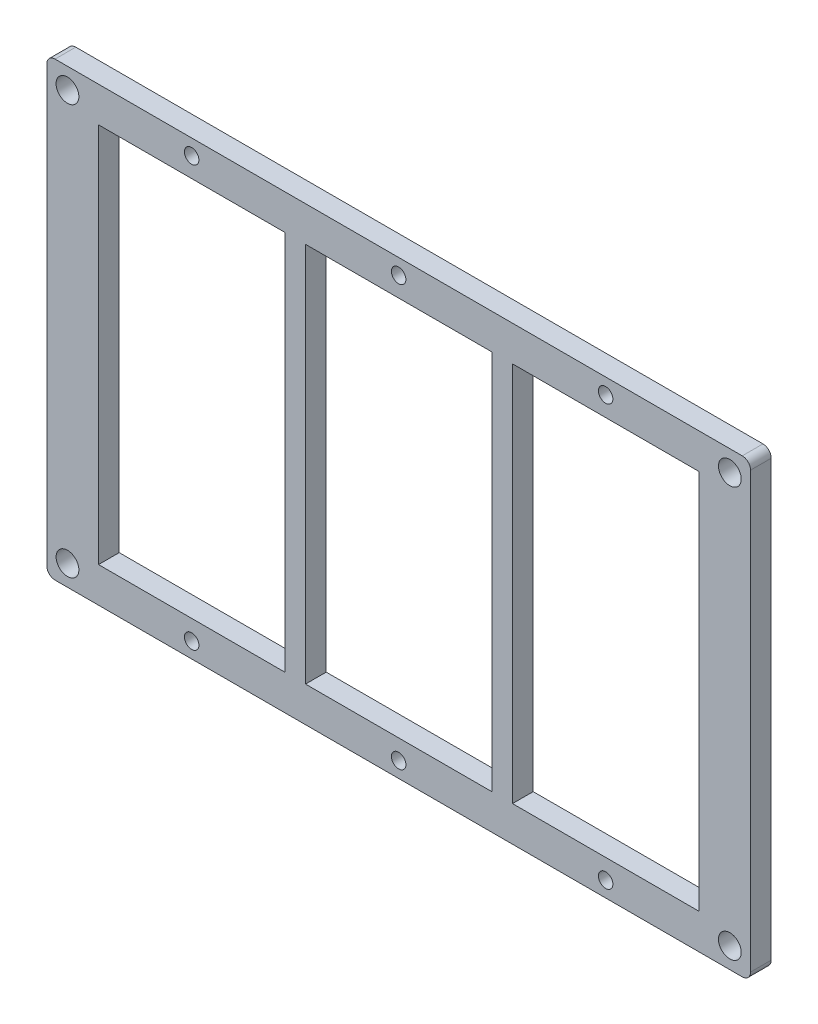
ISO-10303-21;
HEADER;
FILE_DESCRIPTION(('STEP AP214'),'2;1');
FILE_NAME('part.step','',(''),(''),'','','');
FILE_SCHEMA(('AUTOMOTIVE_DESIGN { 1 0 10303 214 1 1 1 1 }'));
ENDSEC;
DATA;
#1=APPLICATION_CONTEXT('core data for automotive mechanical design processes');
#2=APPLICATION_PROTOCOL_DEFINITION('international standard','automotive_design',2000,#1);
#3=PRODUCT_CONTEXT('',#1,'mechanical');
#4=PRODUCT('Part','Part','',(#3));
#5=PRODUCT_RELATED_PRODUCT_CATEGORY('part','',(#4));
#6=PRODUCT_DEFINITION_FORMATION('','',#4);
#7=PRODUCT_DEFINITION_CONTEXT('part definition',#1,'design');
#8=PRODUCT_DEFINITION('design','',#6,#7);
#9=PRODUCT_DEFINITION_SHAPE('','',#8);
#10=(LENGTH_UNIT() NAMED_UNIT(*) SI_UNIT(.MILLI.,.METRE.));
#11=(NAMED_UNIT(*) PLANE_ANGLE_UNIT() SI_UNIT($,.RADIAN.));
#12=(NAMED_UNIT(*) SI_UNIT($,.STERADIAN.) SOLID_ANGLE_UNIT());
#13=UNCERTAINTY_MEASURE_WITH_UNIT(LENGTH_MEASURE(1.E-05),#10,'distance_accuracy_value','');
#14=(GEOMETRIC_REPRESENTATION_CONTEXT(3) GLOBAL_UNCERTAINTY_ASSIGNED_CONTEXT((#13)) GLOBAL_UNIT_ASSIGNED_CONTEXT((#10,
#11,#12)) REPRESENTATION_CONTEXT('',''));
#15=CARTESIAN_POINT('',(0.,0.,0.));
#16=DIRECTION('',(0.,0.,1.));
#17=DIRECTION('',(1.,0.,0.));
#18=AXIS2_PLACEMENT_3D('',#15,#16,#17);
#19=CARTESIAN_POINT('',(100.,-50.75,0.));
#20=DIRECTION('',(0.,0.,1.));
#21=DIRECTION('',(1.,0.,0.));
#22=AXIS2_PLACEMENT_3D('',#19,#20,#21);
#23=CYLINDRICAL_SURFACE('',#22,1.75);
#24=CARTESIAN_POINT('',(100.,-50.75,0.));
#25=DIRECTION('',(0.,0.,1.));
#26=DIRECTION('',(1.,0.,0.));
#27=AXIS2_PLACEMENT_3D('',#24,#25,#26);
#28=CIRCLE('',#27,1.75);
#29=CARTESIAN_POINT('',(101.75,-50.75,0.));
#30=VERTEX_POINT('',#29);
#31=EDGE_CURVE('E272',#30,#30,#28,.T.);
#32=ORIENTED_EDGE('',*,*,#31,.F.);
#33=EDGE_LOOP('',(#32));
#34=FACE_BOUND('',#33,.T.);
#35=CARTESIAN_POINT('',(100.,-50.75,5.));
#36=DIRECTION('',(0.,0.,1.));
#37=DIRECTION('',(1.,0.,0.));
#38=AXIS2_PLACEMENT_3D('',#35,#36,#37);
#39=CIRCLE('',#38,1.75);
#40=CARTESIAN_POINT('',(101.75,-50.75,5.));
#41=VERTEX_POINT('',#40);
#42=EDGE_CURVE('E275',#41,#41,#39,.T.);
#43=ORIENTED_EDGE('',*,*,#42,.T.);
#44=EDGE_LOOP('',(#43));
#45=FACE_BOUND('',#44,.T.);
#46=ADVANCED_FACE('F33',(#34,#45),#23,.F.);
#47=CARTESIAN_POINT('',(100.,50.75,0.));
#48=DIRECTION('',(0.,0.,1.));
#49=DIRECTION('',(1.,0.,0.));
#50=AXIS2_PLACEMENT_3D('',#47,#48,#49);
#51=CYLINDRICAL_SURFACE('',#50,1.75);
#52=CARTESIAN_POINT('',(100.,50.75,0.));
#53=DIRECTION('',(0.,0.,1.));
#54=DIRECTION('',(1.,0.,0.));
#55=AXIS2_PLACEMENT_3D('',#52,#53,#54);
#56=CIRCLE('',#55,1.75);
#57=CARTESIAN_POINT('',(101.75,50.75,0.));
#58=VERTEX_POINT('',#57);
#59=EDGE_CURVE('E259',#58,#58,#56,.T.);
#60=ORIENTED_EDGE('',*,*,#59,.F.);
#61=EDGE_LOOP('',(#60));
#62=FACE_BOUND('',#61,.T.);
#63=CARTESIAN_POINT('',(100.,50.75,5.));
#64=DIRECTION('',(0.,0.,1.));
#65=DIRECTION('',(1.,0.,0.));
#66=AXIS2_PLACEMENT_3D('',#63,#64,#65);
#67=CIRCLE('',#66,1.75);
#68=CARTESIAN_POINT('',(101.75,50.75,5.));
#69=VERTEX_POINT('',#68);
#70=EDGE_CURVE('E269',#69,#69,#67,.T.);
#71=ORIENTED_EDGE('',*,*,#70,.T.);
#72=EDGE_LOOP('',(#71));
#73=FACE_BOUND('',#72,.T.);
#74=ADVANCED_FACE('F410',(#62,#73),#51,.F.);
#75=CARTESIAN_POINT('',(0.,0.,5.));
#76=DIRECTION('',(0.,0.,1.));
#77=DIRECTION('',(1.,0.,0.));
#78=AXIS2_PLACEMENT_3D('',#75,#76,#77);
#79=PLANE('',#78);
#80=CARTESIAN_POINT('',(-30.,49.5,5.));
#81=DIRECTION('',(0.,0.,1.));
#82=DIRECTION('',(1.,0.,0.));
#83=AXIS2_PLACEMENT_3D('',#80,#81,#82);
#84=CIRCLE('',#83,2.75);
#85=CARTESIAN_POINT('',(-27.25,49.5,5.));
#86=VERTEX_POINT('',#85);
#87=EDGE_CURVE('E749',#86,#86,#84,.T.);
#88=ORIENTED_EDGE('',*,*,#87,.F.);
#89=EDGE_LOOP('',(#88));
#90=FACE_BOUND('',#89,.T.);
#91=CARTESIAN_POINT('',(130.,49.5,5.));
#92=DIRECTION('',(0.,0.,1.));
#93=DIRECTION('',(1.,0.,0.));
#94=AXIS2_PLACEMENT_3D('',#91,#92,#93);
#95=CIRCLE('',#94,2.75);
#96=CARTESIAN_POINT('',(132.75,49.5,5.));
#97=VERTEX_POINT('',#96);
#98=EDGE_CURVE('E751',#97,#97,#95,.T.);
#99=ORIENTED_EDGE('',*,*,#98,.F.);
#100=EDGE_LOOP('',(#99));
#101=FACE_BOUND('',#100,.T.);
#102=CARTESIAN_POINT('',(130.,-49.5,5.));
#103=DIRECTION('',(0.,0.,1.));
#104=DIRECTION('',(1.,0.,0.));
#105=AXIS2_PLACEMENT_3D('',#102,#103,#104);
#106=CIRCLE('',#105,2.75);
#107=CARTESIAN_POINT('',(132.75,-49.5,5.));
#108=VERTEX_POINT('',#107);
#109=EDGE_CURVE('E759',#108,#108,#106,.T.);
#110=ORIENTED_EDGE('',*,*,#109,.F.);
#111=EDGE_LOOP('',(#110));
#112=FACE_BOUND('',#111,.T.);
#113=CARTESIAN_POINT('',(-30.,-49.5,5.));
#114=DIRECTION('',(0.,0.,1.));
#115=DIRECTION('',(1.,0.,0.));
#116=AXIS2_PLACEMENT_3D('',#113,#114,#115);
#117=CIRCLE('',#116,2.75);
#118=CARTESIAN_POINT('',(-27.25,-49.5,5.));
#119=VERTEX_POINT('',#118);
#120=EDGE_CURVE('E764',#119,#119,#117,.T.);
#121=ORIENTED_EDGE('',*,*,#120,.F.);
#122=EDGE_LOOP('',(#121));
#123=FACE_BOUND('',#122,.T.);
#124=CARTESIAN_POINT('',(50.,-50.75,5.));
#125=DIRECTION('',(0.,0.,1.));
#126=DIRECTION('',(1.,0.,0.));
#127=AXIS2_PLACEMENT_3D('',#124,#125,#126);
#128=CIRCLE('',#127,1.75);
#129=CARTESIAN_POINT('',(51.75,-50.75,5.));
#130=VERTEX_POINT('',#129);
#131=EDGE_CURVE('E339',#130,#130,#128,.T.);
#132=ORIENTED_EDGE('',*,*,#131,.F.);
#133=EDGE_LOOP('',(#132));
#134=FACE_BOUND('',#133,.T.);
#135=CARTESIAN_POINT('',(50.,50.75,5.));
#136=DIRECTION('',(0.,0.,1.));
#137=DIRECTION('',(1.,0.,0.));
#138=AXIS2_PLACEMENT_3D('',#135,#136,#137);
#139=CIRCLE('',#138,1.75);
#140=CARTESIAN_POINT('',(51.75,50.75,5.));
#141=VERTEX_POINT('',#140);
#142=EDGE_CURVE('E345',#141,#141,#139,.T.);
#143=ORIENTED_EDGE('',*,*,#142,.F.);
#144=EDGE_LOOP('',(#143));
#145=FACE_BOUND('',#144,.T.);
#146=DIRECTION('',(0.,1.,0.));
#147=VECTOR('',#146,1.);
#148=CARTESIAN_POINT('',(22.5,-46.,5.));
#149=LINE('',#148,#147);
#150=CARTESIAN_POINT('',(22.5,-46.,5.));
#151=VERTEX_POINT('',#150);
#152=CARTESIAN_POINT('',(22.5,46.,5.));
#153=VERTEX_POINT('',#152);
#154=EDGE_CURVE('E223',#151,#153,#149,.T.);
#155=ORIENTED_EDGE('',*,*,#154,.F.);
#156=DIRECTION('',(1.,0.,0.));
#157=VECTOR('',#156,1.);
#158=CARTESIAN_POINT('',(22.5,-46.,5.));
#159=LINE('',#158,#157);
#160=CARTESIAN_POINT('',(-22.5,-46.,5.));
#161=VERTEX_POINT('',#160);
#162=EDGE_CURVE('E220',#161,#151,#159,.T.);
#163=ORIENTED_EDGE('',*,*,#162,.F.);
#164=DIRECTION('',(0.,-1.,0.));
#165=VECTOR('',#164,1.);
#166=CARTESIAN_POINT('',(-22.5,-46.,5.));
#167=LINE('',#166,#165);
#168=CARTESIAN_POINT('',(-22.5,46.,5.));
#169=VERTEX_POINT('',#168);
#170=EDGE_CURVE('E218',#169,#161,#167,.T.);
#171=ORIENTED_EDGE('',*,*,#170,.F.);
#172=DIRECTION('',(-1.,0.,0.));
#173=VECTOR('',#172,1.);
#174=CARTESIAN_POINT('',(22.5,46.,5.));
#175=LINE('',#174,#173);
#176=EDGE_CURVE('E226',#153,#169,#175,.T.);
#177=ORIENTED_EDGE('',*,*,#176,.F.);
#178=EDGE_LOOP('',(#155,#163,#171,#177));
#179=FACE_BOUND('',#178,.T.);
#180=DIRECTION('',(1.,0.,0.));
#181=VECTOR('',#180,1.);
#182=CARTESIAN_POINT('',(72.5,-46.,5.));
#183=LINE('',#182,#181);
#184=CARTESIAN_POINT('',(27.5,-46.,5.));
#185=VERTEX_POINT('',#184);
#186=CARTESIAN_POINT('',(72.5,-46.,5.));
#187=VERTEX_POINT('',#186);
#188=EDGE_CURVE('E361',#185,#187,#183,.T.);
#189=ORIENTED_EDGE('',*,*,#188,.F.);
#190=DIRECTION('',(0.,1.,0.));
#191=VECTOR('',#190,1.);
#192=CARTESIAN_POINT('',(27.5,-54.5,5.));
#193=LINE('',#192,#191);
#194=CARTESIAN_POINT('',(27.5,46.,5.));
#195=VERTEX_POINT('',#194);
#196=EDGE_CURVE('E252',#185,#195,#193,.T.);
#197=ORIENTED_EDGE('',*,*,#196,.T.);
#198=DIRECTION('',(-1.,0.,0.));
#199=VECTOR('',#198,1.);
#200=CARTESIAN_POINT('',(72.5,46.,5.));
#201=LINE('',#200,#199);
#202=CARTESIAN_POINT('',(72.5,46.,5.));
#203=VERTEX_POINT('',#202);
#204=EDGE_CURVE('E367',#203,#195,#201,.T.);
#205=ORIENTED_EDGE('',*,*,#204,.F.);
#206=DIRECTION('',(0.,1.,0.));
#207=VECTOR('',#206,1.);
#208=CARTESIAN_POINT('',(72.5,-46.,5.));
#209=LINE('',#208,#207);
#210=EDGE_CURVE('E363',#187,#203,#209,.T.);
#211=ORIENTED_EDGE('',*,*,#210,.F.);
#212=EDGE_LOOP('',(#189,#197,#205,#211));
#213=FACE_BOUND('',#212,.T.);
#214=DIRECTION('',(0.,-1.,0.));
#215=VECTOR('',#214,1.);
#216=CARTESIAN_POINT('',(-35.,54.5,5.));
#217=LINE('',#216,#215);
#218=CARTESIAN_POINT('',(-35.,52.5,5.));
#219=VERTEX_POINT('',#218);
#220=CARTESIAN_POINT('',(-35.,-52.5,5.));
#221=VERTEX_POINT('',#220);
#222=EDGE_CURVE('E325',#219,#221,#217,.T.);
#223=ORIENTED_EDGE('',*,*,#222,.T.);
#224=CARTESIAN_POINT('',(-33.,-52.5,5.));
#225=DIRECTION('',(0.,0.,1.));
#226=DIRECTION('',(1.,0.,0.));
#227=AXIS2_PLACEMENT_3D('',#224,#225,#226);
#228=CIRCLE('',#227,2.);
#229=CARTESIAN_POINT('',(-33.,-54.5,5.));
#230=VERTEX_POINT('',#229);
#231=EDGE_CURVE('E289',#221,#230,#228,.T.);
#232=ORIENTED_EDGE('',*,*,#231,.T.);
#233=DIRECTION('',(1.,0.,0.));
#234=VECTOR('',#233,1.);
#235=CARTESIAN_POINT('',(27.5,-54.5,5.));
#236=LINE('',#235,#234);
#237=CARTESIAN_POINT('',(133.,-54.5,5.));
#238=VERTEX_POINT('',#237);
#239=EDGE_CURVE('E249',#230,#238,#236,.T.);
#240=ORIENTED_EDGE('',*,*,#239,.T.);
#241=CARTESIAN_POINT('',(133.,-52.5,5.));
#242=DIRECTION('',(0.,0.,1.));
#243=DIRECTION('',(1.,0.,0.));
#244=AXIS2_PLACEMENT_3D('',#241,#242,#243);
#245=CIRCLE('',#244,2.);
#246=CARTESIAN_POINT('',(135.,-52.5,5.));
#247=VERTEX_POINT('',#246);
#248=EDGE_CURVE('E287',#238,#247,#245,.T.);
#249=ORIENTED_EDGE('',*,*,#248,.T.);
#250=DIRECTION('',(0.,1.,0.));
#251=VECTOR('',#250,1.);
#252=CARTESIAN_POINT('',(135.,54.5,5.));
#253=LINE('',#252,#251);
#254=CARTESIAN_POINT('',(135.,52.5,5.));
#255=VERTEX_POINT('',#254);
#256=EDGE_CURVE('E318',#247,#255,#253,.T.);
#257=ORIENTED_EDGE('',*,*,#256,.T.);
#258=CARTESIAN_POINT('',(133.,52.5,5.));
#259=DIRECTION('',(0.,0.,1.));
#260=DIRECTION('',(1.,0.,0.));
#261=AXIS2_PLACEMENT_3D('',#258,#259,#260);
#262=CIRCLE('',#261,2.);
#263=CARTESIAN_POINT('',(133.,54.5,5.));
#264=VERTEX_POINT('',#263);
#265=EDGE_CURVE('E285',#255,#264,#262,.T.);
#266=ORIENTED_EDGE('',*,*,#265,.T.);
#267=DIRECTION('',(-1.,0.,0.));
#268=VECTOR('',#267,1.);
#269=CARTESIAN_POINT('',(27.5,54.5,5.));
#270=LINE('',#269,#268);
#271=CARTESIAN_POINT('',(-33.,54.5,5.));
#272=VERTEX_POINT('',#271);
#273=EDGE_CURVE('E256',#264,#272,#270,.T.);
#274=ORIENTED_EDGE('',*,*,#273,.T.);
#275=CARTESIAN_POINT('',(-33.,52.5,5.));
#276=DIRECTION('',(0.,0.,1.));
#277=DIRECTION('',(1.,0.,0.));
#278=AXIS2_PLACEMENT_3D('',#275,#276,#277);
#279=CIRCLE('',#278,2.);
#280=EDGE_CURVE('E283',#272,#219,#279,.T.);
#281=ORIENTED_EDGE('',*,*,#280,.T.);
#282=EDGE_LOOP('',(#223,#232,#240,#249,#257,#266,#274,#281));
#283=FACE_BOUND('',#282,.T.);
#284=DIRECTION('',(1.,0.,0.));
#285=VECTOR('',#284,1.);
#286=CARTESIAN_POINT('',(122.5,-46.,5.));
#287=LINE('',#286,#285);
#288=CARTESIAN_POINT('',(77.5,-46.,5.));
#289=VERTEX_POINT('',#288);
#290=CARTESIAN_POINT('',(122.5,-46.,5.));
#291=VERTEX_POINT('',#290);
#292=EDGE_CURVE('E173',#289,#291,#287,.T.);
#293=ORIENTED_EDGE('',*,*,#292,.F.);
#294=DIRECTION('',(0.,1.,0.));
#295=VECTOR('',#294,1.);
#296=CARTESIAN_POINT('',(77.5,-54.5,5.));
#297=LINE('',#296,#295);
#298=CARTESIAN_POINT('',(77.5,46.,5.));
#299=VERTEX_POINT('',#298);
#300=EDGE_CURVE('E190',#289,#299,#297,.T.);
#301=ORIENTED_EDGE('',*,*,#300,.T.);
#302=DIRECTION('',(-1.,0.,0.));
#303=VECTOR('',#302,1.);
#304=CARTESIAN_POINT('',(122.5,46.,5.));
#305=LINE('',#304,#303);
#306=CARTESIAN_POINT('',(122.5,46.,5.));
#307=VERTEX_POINT('',#306);
#308=EDGE_CURVE('E349',#307,#299,#305,.T.);
#309=ORIENTED_EDGE('',*,*,#308,.F.);
#310=DIRECTION('',(0.,1.,0.));
#311=VECTOR('',#310,1.);
#312=CARTESIAN_POINT('',(122.5,-46.,5.));
#313=LINE('',#312,#311);
#314=EDGE_CURVE('E192',#291,#307,#313,.T.);
#315=ORIENTED_EDGE('',*,*,#314,.F.);
#316=EDGE_LOOP('',(#293,#301,#309,#315));
#317=FACE_BOUND('',#316,.T.);
#318=CARTESIAN_POINT('',(0.,50.75,5.));
#319=DIRECTION('',(0.,0.,1.));
#320=DIRECTION('',(1.,0.,0.));
#321=AXIS2_PLACEMENT_3D('',#318,#319,#320);
#322=CIRCLE('',#321,1.75);
#323=CARTESIAN_POINT('',(1.75,50.75,5.));
#324=VERTEX_POINT('',#323);
#325=EDGE_CURVE('E213',#324,#324,#322,.T.);
#326=ORIENTED_EDGE('',*,*,#325,.F.);
#327=EDGE_LOOP('',(#326));
#328=FACE_BOUND('',#327,.T.);
#329=CARTESIAN_POINT('',(0.,-50.75,5.));
#330=DIRECTION('',(0.,0.,1.));
#331=DIRECTION('',(1.,0.,0.));
#332=AXIS2_PLACEMENT_3D('',#329,#330,#331);
#333=CIRCLE('',#332,1.75);
#334=CARTESIAN_POINT('',(1.75000000000002,-50.75,5.));
#335=VERTEX_POINT('',#334);
#336=EDGE_CURVE('E198',#335,#335,#333,.T.);
#337=ORIENTED_EDGE('',*,*,#336,.F.);
#338=EDGE_LOOP('',(#337));
#339=FACE_BOUND('',#338,.T.);
#340=ORIENTED_EDGE('',*,*,#70,.F.);
#341=EDGE_LOOP('',(#340));
#342=FACE_BOUND('',#341,.T.);
#343=ORIENTED_EDGE('',*,*,#42,.F.);
#344=EDGE_LOOP('',(#343));
#345=FACE_BOUND('',#344,.T.);
#346=ADVANCED_FACE('F187',(#90,#101,#112,#123,#134,#145,#179,#213,#283,#317,#328,#339,#342,
#345),#79,.T.);
#347=CARTESIAN_POINT('',(0.,0.,0.));
#348=DIRECTION('',(0.,0.,1.));
#349=DIRECTION('',(1.,0.,0.));
#350=AXIS2_PLACEMENT_3D('',#347,#348,#349);
#351=PLANE('',#350);
#352=CARTESIAN_POINT('',(-30.,49.5,0.));
#353=DIRECTION('',(0.,0.,1.));
#354=DIRECTION('',(1.,0.,0.));
#355=AXIS2_PLACEMENT_3D('',#352,#353,#354);
#356=CIRCLE('',#355,2.75);
#357=CARTESIAN_POINT('',(-27.25,49.5,0.));
#358=VERTEX_POINT('',#357);
#359=EDGE_CURVE('E746',#358,#358,#356,.T.);
#360=ORIENTED_EDGE('',*,*,#359,.T.);
#361=EDGE_LOOP('',(#360));
#362=FACE_BOUND('',#361,.T.);
#363=CARTESIAN_POINT('',(130.,49.5,0.));
#364=DIRECTION('',(0.,0.,1.));
#365=DIRECTION('',(1.,0.,0.));
#366=AXIS2_PLACEMENT_3D('',#363,#364,#365);
#367=CIRCLE('',#366,2.75);
#368=CARTESIAN_POINT('',(132.75,49.5,0.));
#369=VERTEX_POINT('',#368);
#370=EDGE_CURVE('E756',#369,#369,#367,.T.);
#371=ORIENTED_EDGE('',*,*,#370,.T.);
#372=EDGE_LOOP('',(#371));
#373=FACE_BOUND('',#372,.T.);
#374=CARTESIAN_POINT('',(130.,-49.5,0.));
#375=DIRECTION('',(0.,0.,1.));
#376=DIRECTION('',(1.,0.,0.));
#377=AXIS2_PLACEMENT_3D('',#374,#375,#376);
#378=CIRCLE('',#377,2.75);
#379=CARTESIAN_POINT('',(132.75,-49.5,0.));
#380=VERTEX_POINT('',#379);
#381=EDGE_CURVE('E762',#380,#380,#378,.T.);
#382=ORIENTED_EDGE('',*,*,#381,.T.);
#383=EDGE_LOOP('',(#382));
#384=FACE_BOUND('',#383,.T.);
#385=CARTESIAN_POINT('',(-30.,-49.5,0.));
#386=DIRECTION('',(0.,0.,1.));
#387=DIRECTION('',(1.,0.,0.));
#388=AXIS2_PLACEMENT_3D('',#385,#386,#387);
#389=CIRCLE('',#388,2.75);
#390=CARTESIAN_POINT('',(-27.25,-49.5,0.));
#391=VERTEX_POINT('',#390);
#392=EDGE_CURVE('E329',#391,#391,#389,.T.);
#393=ORIENTED_EDGE('',*,*,#392,.T.);
#394=EDGE_LOOP('',(#393));
#395=FACE_BOUND('',#394,.T.);
#396=CARTESIAN_POINT('',(50.,-50.75,0.));
#397=DIRECTION('',(0.,0.,1.));
#398=DIRECTION('',(1.,0.,0.));
#399=AXIS2_PLACEMENT_3D('',#396,#397,#398);
#400=CIRCLE('',#399,1.75);
#401=CARTESIAN_POINT('',(51.75,-50.75,0.));
#402=VERTEX_POINT('',#401);
#403=EDGE_CURVE('E335',#402,#402,#400,.T.);
#404=ORIENTED_EDGE('',*,*,#403,.T.);
#405=EDGE_LOOP('',(#404));
#406=FACE_BOUND('',#405,.T.);
#407=CARTESIAN_POINT('',(50.,50.75,0.));
#408=DIRECTION('',(0.,0.,1.));
#409=DIRECTION('',(1.,0.,0.));
#410=AXIS2_PLACEMENT_3D('',#407,#408,#409);
#411=CIRCLE('',#410,1.75);
#412=CARTESIAN_POINT('',(51.75,50.75,0.));
#413=VERTEX_POINT('',#412);
#414=EDGE_CURVE('E342',#413,#413,#411,.T.);
#415=ORIENTED_EDGE('',*,*,#414,.T.);
#416=EDGE_LOOP('',(#415));
#417=FACE_BOUND('',#416,.T.);
#418=DIRECTION('',(1.,0.,0.));
#419=VECTOR('',#418,1.);
#420=CARTESIAN_POINT('',(22.5,-46.,0.));
#421=LINE('',#420,#419);
#422=CARTESIAN_POINT('',(-22.5,-46.,0.));
#423=VERTEX_POINT('',#422);
#424=CARTESIAN_POINT('',(22.5,-46.,0.));
#425=VERTEX_POINT('',#424);
#426=EDGE_CURVE('E231',#423,#425,#421,.T.);
#427=ORIENTED_EDGE('',*,*,#426,.T.);
#428=DIRECTION('',(0.,1.,0.));
#429=VECTOR('',#428,1.);
#430=CARTESIAN_POINT('',(22.5,-46.,0.));
#431=LINE('',#430,#429);
#432=CARTESIAN_POINT('',(22.5,46.,0.));
#433=VERTEX_POINT('',#432);
#434=EDGE_CURVE('E234',#425,#433,#431,.T.);
#435=ORIENTED_EDGE('',*,*,#434,.T.);
#436=DIRECTION('',(-1.,0.,0.));
#437=VECTOR('',#436,1.);
#438=CARTESIAN_POINT('',(22.5,46.,0.));
#439=LINE('',#438,#437);
#440=CARTESIAN_POINT('',(-22.5,46.,0.));
#441=VERTEX_POINT('',#440);
#442=EDGE_CURVE('E221',#433,#441,#439,.T.);
#443=ORIENTED_EDGE('',*,*,#442,.T.);
#444=DIRECTION('',(0.,-1.,0.));
#445=VECTOR('',#444,1.);
#446=CARTESIAN_POINT('',(-22.5,-46.,0.));
#447=LINE('',#446,#445);
#448=EDGE_CURVE('E212',#441,#423,#447,.T.);
#449=ORIENTED_EDGE('',*,*,#448,.T.);
#450=EDGE_LOOP('',(#427,#435,#443,#449));
#451=FACE_BOUND('',#450,.T.);
#452=DIRECTION('',(0.,1.,0.));
#453=VECTOR('',#452,1.);
#454=CARTESIAN_POINT('',(27.5,-54.5,0.));
#455=LINE('',#454,#453);
#456=CARTESIAN_POINT('',(27.5,-46.,0.));
#457=VERTEX_POINT('',#456);
#458=CARTESIAN_POINT('',(27.5,46.,0.));
#459=VERTEX_POINT('',#458);
#460=EDGE_CURVE('E262',#457,#459,#455,.T.);
#461=ORIENTED_EDGE('',*,*,#460,.F.);
#462=DIRECTION('',(1.,0.,0.));
#463=VECTOR('',#462,1.);
#464=CARTESIAN_POINT('',(72.5,-46.,0.));
#465=LINE('',#464,#463);
#466=CARTESIAN_POINT('',(72.5,-46.,0.));
#467=VERTEX_POINT('',#466);
#468=EDGE_CURVE('E181',#457,#467,#465,.T.);
#469=ORIENTED_EDGE('',*,*,#468,.T.);
#470=DIRECTION('',(0.,1.,0.));
#471=VECTOR('',#470,1.);
#472=CARTESIAN_POINT('',(72.5,-46.,0.));
#473=LINE('',#472,#471);
#474=CARTESIAN_POINT('',(72.5,46.,0.));
#475=VERTEX_POINT('',#474);
#476=EDGE_CURVE('E372',#467,#475,#473,.T.);
#477=ORIENTED_EDGE('',*,*,#476,.T.);
#478=DIRECTION('',(-1.,0.,0.));
#479=VECTOR('',#478,1.);
#480=CARTESIAN_POINT('',(72.5,46.,0.));
#481=LINE('',#480,#479);
#482=EDGE_CURVE('E364',#475,#459,#481,.T.);
#483=ORIENTED_EDGE('',*,*,#482,.T.);
#484=EDGE_LOOP('',(#461,#469,#477,#483));
#485=FACE_BOUND('',#484,.T.);
#486=DIRECTION('',(1.,0.,0.));
#487=VECTOR('',#486,1.);
#488=CARTESIAN_POINT('',(27.5,-54.5,0.));
#489=LINE('',#488,#487);
#490=CARTESIAN_POINT('',(-33.,-54.5,0.));
#491=VERTEX_POINT('',#490);
#492=CARTESIAN_POINT('',(133.,-54.5,0.));
#493=VERTEX_POINT('',#492);
#494=EDGE_CURVE('E248',#491,#493,#489,.T.);
#495=ORIENTED_EDGE('',*,*,#494,.F.);
#496=CARTESIAN_POINT('',(-33.,-52.5,0.));
#497=DIRECTION('',(0.,0.,1.));
#498=DIRECTION('',(1.,0.,0.));
#499=AXIS2_PLACEMENT_3D('',#496,#497,#498);
#500=CIRCLE('',#499,2.);
#501=CARTESIAN_POINT('',(-35.,-52.5,0.));
#502=VERTEX_POINT('',#501);
#503=EDGE_CURVE('E301',#491,#502,#500,.F.);
#504=ORIENTED_EDGE('',*,*,#503,.T.);
#505=DIRECTION('',(0.,1.,0.));
#506=VECTOR('',#505,1.);
#507=CARTESIAN_POINT('',(-35.,54.5,0.));
#508=LINE('',#507,#506);
#509=CARTESIAN_POINT('',(-35.,52.5,0.));
#510=VERTEX_POINT('',#509);
#511=EDGE_CURVE('E327',#502,#510,#508,.T.);
#512=ORIENTED_EDGE('',*,*,#511,.T.);
#513=CARTESIAN_POINT('',(-33.,52.5,0.));
#514=DIRECTION('',(0.,0.,1.));
#515=DIRECTION('',(1.,0.,0.));
#516=AXIS2_PLACEMENT_3D('',#513,#514,#515);
#517=CIRCLE('',#516,2.);
#518=CARTESIAN_POINT('',(-33.,54.5,0.));
#519=VERTEX_POINT('',#518);
#520=EDGE_CURVE('E296',#510,#519,#517,.F.);
#521=ORIENTED_EDGE('',*,*,#520,.T.);
#522=DIRECTION('',(-1.,0.,0.));
#523=VECTOR('',#522,1.);
#524=CARTESIAN_POINT('',(27.5,54.5,0.));
#525=LINE('',#524,#523);
#526=CARTESIAN_POINT('',(133.,54.5,0.));
#527=VERTEX_POINT('',#526);
#528=EDGE_CURVE('E253',#527,#519,#525,.T.);
#529=ORIENTED_EDGE('',*,*,#528,.F.);
#530=CARTESIAN_POINT('',(133.,52.5,0.));
#531=DIRECTION('',(0.,0.,1.));
#532=DIRECTION('',(1.,0.,0.));
#533=AXIS2_PLACEMENT_3D('',#530,#531,#532);
#534=CIRCLE('',#533,2.);
#535=CARTESIAN_POINT('',(135.,52.5,0.));
#536=VERTEX_POINT('',#535);
#537=EDGE_CURVE('E55',#527,#536,#534,.F.);
#538=ORIENTED_EDGE('',*,*,#537,.T.);
#539=DIRECTION('',(0.,-1.,0.));
#540=VECTOR('',#539,1.);
#541=CARTESIAN_POINT('',(135.,54.5,0.));
#542=LINE('',#541,#540);
#543=CARTESIAN_POINT('',(135.,-52.5,0.));
#544=VERTEX_POINT('',#543);
#545=EDGE_CURVE('E323',#536,#544,#542,.T.);
#546=ORIENTED_EDGE('',*,*,#545,.T.);
#547=CARTESIAN_POINT('',(133.,-52.5,0.));
#548=DIRECTION('',(0.,0.,1.));
#549=DIRECTION('',(1.,0.,0.));
#550=AXIS2_PLACEMENT_3D('',#547,#548,#549);
#551=CIRCLE('',#550,2.);
#552=EDGE_CURVE('E299',#544,#493,#551,.F.);
#553=ORIENTED_EDGE('',*,*,#552,.T.);
#554=EDGE_LOOP('',(#495,#504,#512,#521,#529,#538,#546,#553));
#555=FACE_BOUND('',#554,.T.);
#556=DIRECTION('',(0.,1.,0.));
#557=VECTOR('',#556,1.);
#558=CARTESIAN_POINT('',(77.5,-54.5,0.));
#559=LINE('',#558,#557);
#560=CARTESIAN_POINT('',(77.5,-46.,0.));
#561=VERTEX_POINT('',#560);
#562=CARTESIAN_POINT('',(77.5,46.,0.));
#563=VERTEX_POINT('',#562);
#564=EDGE_CURVE('E199',#561,#563,#559,.T.);
#565=ORIENTED_EDGE('',*,*,#564,.F.);
#566=DIRECTION('',(1.,0.,0.));
#567=VECTOR('',#566,1.);
#568=CARTESIAN_POINT('',(122.5,-46.,0.));
#569=LINE('',#568,#567);
#570=CARTESIAN_POINT('',(122.5,-46.,0.));
#571=VERTEX_POINT('',#570);
#572=EDGE_CURVE('E176',#561,#571,#569,.T.);
#573=ORIENTED_EDGE('',*,*,#572,.T.);
#574=DIRECTION('',(0.,1.,0.));
#575=VECTOR('',#574,1.);
#576=CARTESIAN_POINT('',(122.5,-46.,0.));
#577=LINE('',#576,#575);
#578=CARTESIAN_POINT('',(122.5,46.,0.));
#579=VERTEX_POINT('',#578);
#580=EDGE_CURVE('E352',#571,#579,#577,.T.);
#581=ORIENTED_EDGE('',*,*,#580,.T.);
#582=DIRECTION('',(-1.,0.,0.));
#583=VECTOR('',#582,1.);
#584=CARTESIAN_POINT('',(122.5,46.,0.));
#585=LINE('',#584,#583);
#586=EDGE_CURVE('E193',#579,#563,#585,.T.);
#587=ORIENTED_EDGE('',*,*,#586,.T.);
#588=EDGE_LOOP('',(#565,#573,#581,#587));
#589=FACE_BOUND('',#588,.T.);
#590=CARTESIAN_POINT('',(0.,-50.75,0.));
#591=DIRECTION('',(0.,0.,1.));
#592=DIRECTION('',(1.,0.,0.));
#593=AXIS2_PLACEMENT_3D('',#590,#591,#592);
#594=CIRCLE('',#593,1.75);
#595=CARTESIAN_POINT('',(1.75000000000002,-50.75,0.));
#596=VERTEX_POINT('',#595);
#597=EDGE_CURVE('E202',#596,#596,#594,.T.);
#598=ORIENTED_EDGE('',*,*,#597,.T.);
#599=EDGE_LOOP('',(#598));
#600=FACE_BOUND('',#599,.T.);
#601=CARTESIAN_POINT('',(0.,50.75,0.));
#602=DIRECTION('',(0.,0.,1.));
#603=DIRECTION('',(1.,0.,0.));
#604=AXIS2_PLACEMENT_3D('',#601,#602,#603);
#605=CIRCLE('',#604,1.75);
#606=CARTESIAN_POINT('',(1.75,50.75,0.));
#607=VERTEX_POINT('',#606);
#608=EDGE_CURVE('E209',#607,#607,#605,.T.);
#609=ORIENTED_EDGE('',*,*,#608,.T.);
#610=EDGE_LOOP('',(#609));
#611=FACE_BOUND('',#610,.T.);
#612=ORIENTED_EDGE('',*,*,#59,.T.);
#613=EDGE_LOOP('',(#612));
#614=FACE_BOUND('',#613,.T.);
#615=ORIENTED_EDGE('',*,*,#31,.T.);
#616=EDGE_LOOP('',(#615));
#617=FACE_BOUND('',#616,.T.);
#618=ADVANCED_FACE('F391',(#362,#373,#384,#395,#406,#417,#451,#485,#555,#589,#600,#611,#614,
#617),#351,.F.);
#619=CARTESIAN_POINT('',(27.5,-54.5,5.));
#620=DIRECTION('',(0.,1.,0.));
#621=DIRECTION('',(0.,0.,1.));
#622=AXIS2_PLACEMENT_3D('',#619,#620,#621);
#623=PLANE('',#622);
#624=ORIENTED_EDGE('',*,*,#239,.F.);
#625=DIRECTION('',(0.,0.,1.));
#626=VECTOR('',#625,1.);
#627=CARTESIAN_POINT('',(-33.,-54.5,0.));
#628=LINE('',#627,#626);
#629=EDGE_CURVE('E294',#230,#491,#628,.F.);
#630=ORIENTED_EDGE('',*,*,#629,.T.);
#631=ORIENTED_EDGE('',*,*,#494,.T.);
#632=DIRECTION('',(0.,0.,1.));
#633=VECTOR('',#632,1.);
#634=CARTESIAN_POINT('',(133.,-54.5,5.));
#635=LINE('',#634,#633);
#636=EDGE_CURVE('E291',#493,#238,#635,.T.);
#637=ORIENTED_EDGE('',*,*,#636,.T.);
#638=EDGE_LOOP('',(#624,#630,#631,#637));
#639=FACE_BOUND('',#638,.T.);
#640=ADVANCED_FACE('F447',(#639),#623,.F.);
#641=CARTESIAN_POINT('',(27.5,-54.5,5.));
#642=DIRECTION('',(-1.,0.,0.));
#643=DIRECTION('',(0.,0.,1.));
#644=AXIS2_PLACEMENT_3D('',#641,#642,#643);
#645=PLANE('',#644);
#646=ORIENTED_EDGE('',*,*,#196,.F.);
#647=DIRECTION('',(0.,0.,-1.));
#648=VECTOR('',#647,1.);
#649=CARTESIAN_POINT('',(27.5,-46.,5.));
#650=LINE('',#649,#648);
#651=EDGE_CURVE('E204',#185,#457,#650,.T.);
#652=ORIENTED_EDGE('',*,*,#651,.T.);
#653=ORIENTED_EDGE('',*,*,#460,.T.);
#654=DIRECTION('',(0.,0.,-1.));
#655=VECTOR('',#654,1.);
#656=CARTESIAN_POINT('',(27.5,46.,5.));
#657=LINE('',#656,#655);
#658=EDGE_CURVE('E369',#195,#459,#657,.T.);
#659=ORIENTED_EDGE('',*,*,#658,.F.);
#660=EDGE_LOOP('',(#646,#652,#653,#659));
#661=FACE_BOUND('',#660,.T.);
#662=ADVANCED_FACE('F387',(#661),#645,.F.);
#663=CARTESIAN_POINT('',(27.5,54.5,5.));
#664=DIRECTION('',(0.,-1.,0.));
#665=DIRECTION('',(0.,0.,-1.));
#666=AXIS2_PLACEMENT_3D('',#663,#664,#665);
#667=PLANE('',#666);
#668=ORIENTED_EDGE('',*,*,#273,.F.);
#669=DIRECTION('',(0.,0.,1.));
#670=VECTOR('',#669,1.);
#671=CARTESIAN_POINT('',(133.,54.5,0.));
#672=LINE('',#671,#670);
#673=EDGE_CURVE('E11',#264,#527,#672,.F.);
#674=ORIENTED_EDGE('',*,*,#673,.T.);
#675=ORIENTED_EDGE('',*,*,#528,.T.);
#676=DIRECTION('',(0.,0.,1.));
#677=VECTOR('',#676,1.);
#678=CARTESIAN_POINT('',(-33.,54.5,5.));
#679=LINE('',#678,#677);
#680=EDGE_CURVE('E41',#519,#272,#679,.T.);
#681=ORIENTED_EDGE('',*,*,#680,.T.);
#682=EDGE_LOOP('',(#668,#674,#675,#681));
#683=FACE_BOUND('',#682,.T.);
#684=ADVANCED_FACE('F310',(#683),#667,.F.);
#685=CARTESIAN_POINT('',(-22.5,-46.,5.));
#686=DIRECTION('',(1.,0.,0.));
#687=DIRECTION('',(0.,0.,-1.));
#688=AXIS2_PLACEMENT_3D('',#685,#686,#687);
#689=PLANE('',#688);
#690=ORIENTED_EDGE('',*,*,#448,.F.);
#691=DIRECTION('',(0.,0.,-1.));
#692=VECTOR('',#691,1.);
#693=CARTESIAN_POINT('',(-22.5,46.,5.));
#694=LINE('',#693,#692);
#695=EDGE_CURVE('E228',#169,#441,#694,.T.);
#696=ORIENTED_EDGE('',*,*,#695,.F.);
#697=ORIENTED_EDGE('',*,*,#170,.T.);
#698=DIRECTION('',(0.,0.,-1.));
#699=VECTOR('',#698,1.);
#700=CARTESIAN_POINT('',(-22.5,-46.,5.));
#701=LINE('',#700,#699);
#702=EDGE_CURVE('E245',#161,#423,#701,.T.);
#703=ORIENTED_EDGE('',*,*,#702,.T.);
#704=EDGE_LOOP('',(#690,#696,#697,#703));
#705=FACE_BOUND('',#704,.T.);
#706=ADVANCED_FACE('F459',(#705),#689,.T.);
#707=CARTESIAN_POINT('',(22.5,-46.,5.));
#708=DIRECTION('',(0.,1.,0.));
#709=DIRECTION('',(0.,0.,1.));
#710=AXIS2_PLACEMENT_3D('',#707,#708,#709);
#711=PLANE('',#710);
#712=ORIENTED_EDGE('',*,*,#426,.F.);
#713=ORIENTED_EDGE('',*,*,#702,.F.);
#714=ORIENTED_EDGE('',*,*,#162,.T.);
#715=DIRECTION('',(0.,0.,-1.));
#716=VECTOR('',#715,1.);
#717=CARTESIAN_POINT('',(22.5,-46.,5.));
#718=LINE('',#717,#716);
#719=EDGE_CURVE('E243',#151,#425,#718,.T.);
#720=ORIENTED_EDGE('',*,*,#719,.T.);
#721=EDGE_LOOP('',(#712,#713,#714,#720));
#722=FACE_BOUND('',#721,.T.);
#723=ADVANCED_FACE('F466',(#722),#711,.T.);
#724=CARTESIAN_POINT('',(22.5,-46.,5.));
#725=DIRECTION('',(-1.,0.,0.));
#726=DIRECTION('',(0.,0.,1.));
#727=AXIS2_PLACEMENT_3D('',#724,#725,#726);
#728=PLANE('',#727);
#729=ORIENTED_EDGE('',*,*,#434,.F.);
#730=ORIENTED_EDGE('',*,*,#719,.F.);
#731=ORIENTED_EDGE('',*,*,#154,.T.);
#732=DIRECTION('',(0.,0.,-1.));
#733=VECTOR('',#732,1.);
#734=CARTESIAN_POINT('',(22.5,46.,5.));
#735=LINE('',#734,#733);
#736=EDGE_CURVE('E241',#153,#433,#735,.T.);
#737=ORIENTED_EDGE('',*,*,#736,.T.);
#738=EDGE_LOOP('',(#729,#730,#731,#737));
#739=FACE_BOUND('',#738,.T.);
#740=ADVANCED_FACE('F470',(#739),#728,.T.);
#741=CARTESIAN_POINT('',(22.5,46.,5.));
#742=DIRECTION('',(0.,-1.,0.));
#743=DIRECTION('',(1.,0.,0.));
#744=AXIS2_PLACEMENT_3D('',#741,#742,#743);
#745=PLANE('',#744);
#746=ORIENTED_EDGE('',*,*,#442,.F.);
#747=ORIENTED_EDGE('',*,*,#736,.F.);
#748=ORIENTED_EDGE('',*,*,#176,.T.);
#749=ORIENTED_EDGE('',*,*,#695,.T.);
#750=EDGE_LOOP('',(#746,#747,#748,#749));
#751=FACE_BOUND('',#750,.T.);
#752=ADVANCED_FACE('F474',(#751),#745,.T.);
#753=CARTESIAN_POINT('',(0.,-50.75,0.));
#754=DIRECTION('',(0.,0.,1.));
#755=DIRECTION('',(1.,0.,0.));
#756=AXIS2_PLACEMENT_3D('',#753,#754,#755);
#757=CYLINDRICAL_SURFACE('',#756,1.75);
#758=ORIENTED_EDGE('',*,*,#597,.F.);
#759=EDGE_LOOP('',(#758));
#760=FACE_BOUND('',#759,.T.);
#761=ORIENTED_EDGE('',*,*,#336,.T.);
#762=EDGE_LOOP('',(#761));
#763=FACE_BOUND('',#762,.T.);
#764=ADVANCED_FACE('F478',(#760,#763),#757,.F.);
#765=CARTESIAN_POINT('',(0.,50.75,0.));
#766=DIRECTION('',(0.,0.,1.));
#767=DIRECTION('',(1.,0.,0.));
#768=AXIS2_PLACEMENT_3D('',#765,#766,#767);
#769=CYLINDRICAL_SURFACE('',#768,1.75);
#770=ORIENTED_EDGE('',*,*,#608,.F.);
#771=EDGE_LOOP('',(#770));
#772=FACE_BOUND('',#771,.T.);
#773=ORIENTED_EDGE('',*,*,#325,.T.);
#774=EDGE_LOOP('',(#773));
#775=FACE_BOUND('',#774,.T.);
#776=ADVANCED_FACE('F482',(#772,#775),#769,.F.);
#777=CARTESIAN_POINT('',(77.5,-54.5,5.));
#778=DIRECTION('',(-1.,0.,0.));
#779=DIRECTION('',(0.,0.,1.));
#780=AXIS2_PLACEMENT_3D('',#777,#778,#779);
#781=PLANE('',#780);
#782=ORIENTED_EDGE('',*,*,#300,.F.);
#783=DIRECTION('',(0.,0.,-1.));
#784=VECTOR('',#783,1.);
#785=CARTESIAN_POINT('',(77.5,-46.,5.));
#786=LINE('',#785,#784);
#787=EDGE_CURVE('E170',#289,#561,#786,.T.);
#788=ORIENTED_EDGE('',*,*,#787,.T.);
#789=ORIENTED_EDGE('',*,*,#564,.T.);
#790=DIRECTION('',(0.,0.,-1.));
#791=VECTOR('',#790,1.);
#792=CARTESIAN_POINT('',(77.5,46.,5.));
#793=LINE('',#792,#791);
#794=EDGE_CURVE('E197',#299,#563,#793,.T.);
#795=ORIENTED_EDGE('',*,*,#794,.F.);
#796=EDGE_LOOP('',(#782,#788,#789,#795));
#797=FACE_BOUND('',#796,.T.);
#798=ADVANCED_FACE('F196',(#797),#781,.F.);
#799=CARTESIAN_POINT('',(72.5,-46.,5.));
#800=DIRECTION('',(0.,1.,0.));
#801=DIRECTION('',(0.,0.,1.));
#802=AXIS2_PLACEMENT_3D('',#799,#800,#801);
#803=PLANE('',#802);
#804=ORIENTED_EDGE('',*,*,#468,.F.);
#805=ORIENTED_EDGE('',*,*,#651,.F.);
#806=ORIENTED_EDGE('',*,*,#188,.T.);
#807=DIRECTION('',(0.,0.,-1.));
#808=VECTOR('',#807,1.);
#809=CARTESIAN_POINT('',(72.5,-46.,5.));
#810=LINE('',#809,#808);
#811=EDGE_CURVE('E379',#187,#467,#810,.T.);
#812=ORIENTED_EDGE('',*,*,#811,.T.);
#813=EDGE_LOOP('',(#804,#805,#806,#812));
#814=FACE_BOUND('',#813,.T.);
#815=ADVANCED_FACE('F398',(#814),#803,.T.);
#816=CARTESIAN_POINT('',(72.5,-46.,5.));
#817=DIRECTION('',(-1.,0.,0.));
#818=DIRECTION('',(0.,0.,1.));
#819=AXIS2_PLACEMENT_3D('',#816,#817,#818);
#820=PLANE('',#819);
#821=ORIENTED_EDGE('',*,*,#476,.F.);
#822=ORIENTED_EDGE('',*,*,#811,.F.);
#823=ORIENTED_EDGE('',*,*,#210,.T.);
#824=DIRECTION('',(0.,0.,-1.));
#825=VECTOR('',#824,1.);
#826=CARTESIAN_POINT('',(72.5,46.,5.));
#827=LINE('',#826,#825);
#828=EDGE_CURVE('E378',#203,#475,#827,.T.);
#829=ORIENTED_EDGE('',*,*,#828,.T.);
#830=EDGE_LOOP('',(#821,#822,#823,#829));
#831=FACE_BOUND('',#830,.T.);
#832=ADVANCED_FACE('F400',(#831),#820,.T.);
#833=CARTESIAN_POINT('',(72.5,46.,5.));
#834=DIRECTION('',(0.,-1.,0.));
#835=DIRECTION('',(1.,0.,0.));
#836=AXIS2_PLACEMENT_3D('',#833,#834,#835);
#837=PLANE('',#836);
#838=ORIENTED_EDGE('',*,*,#482,.F.);
#839=ORIENTED_EDGE('',*,*,#828,.F.);
#840=ORIENTED_EDGE('',*,*,#204,.T.);
#841=ORIENTED_EDGE('',*,*,#658,.T.);
#842=EDGE_LOOP('',(#838,#839,#840,#841));
#843=FACE_BOUND('',#842,.T.);
#844=ADVANCED_FACE('F394',(#843),#837,.T.);
#845=CARTESIAN_POINT('',(122.5,-46.,5.));
#846=DIRECTION('',(0.,1.,0.));
#847=DIRECTION('',(0.,0.,1.));
#848=AXIS2_PLACEMENT_3D('',#845,#846,#847);
#849=PLANE('',#848);
#850=ORIENTED_EDGE('',*,*,#572,.F.);
#851=ORIENTED_EDGE('',*,*,#787,.F.);
#852=ORIENTED_EDGE('',*,*,#292,.T.);
#853=DIRECTION('',(0.,0.,-1.));
#854=VECTOR('',#853,1.);
#855=CARTESIAN_POINT('',(122.5,-46.,5.));
#856=LINE('',#855,#854);
#857=EDGE_CURVE('E182',#291,#571,#856,.T.);
#858=ORIENTED_EDGE('',*,*,#857,.T.);
#859=EDGE_LOOP('',(#850,#851,#852,#858));
#860=FACE_BOUND('',#859,.T.);
#861=ADVANCED_FACE('F172',(#860),#849,.T.);
#862=CARTESIAN_POINT('',(122.5,-46.,5.));
#863=DIRECTION('',(-1.,0.,0.));
#864=DIRECTION('',(0.,0.,1.));
#865=AXIS2_PLACEMENT_3D('',#862,#863,#864);
#866=PLANE('',#865);
#867=ORIENTED_EDGE('',*,*,#580,.F.);
#868=ORIENTED_EDGE('',*,*,#857,.F.);
#869=ORIENTED_EDGE('',*,*,#314,.T.);
#870=DIRECTION('',(0.,0.,-1.));
#871=VECTOR('',#870,1.);
#872=CARTESIAN_POINT('',(122.5,46.,5.));
#873=LINE('',#872,#871);
#874=EDGE_CURVE('E358',#307,#579,#873,.T.);
#875=ORIENTED_EDGE('',*,*,#874,.T.);
#876=EDGE_LOOP('',(#867,#868,#869,#875));
#877=FACE_BOUND('',#876,.T.);
#878=ADVANCED_FACE('F516',(#877),#866,.T.);
#879=CARTESIAN_POINT('',(122.5,46.,5.));
#880=DIRECTION('',(0.,-1.,0.));
#881=DIRECTION('',(1.,0.,0.));
#882=AXIS2_PLACEMENT_3D('',#879,#880,#881);
#883=PLANE('',#882);
#884=ORIENTED_EDGE('',*,*,#586,.F.);
#885=ORIENTED_EDGE('',*,*,#874,.F.);
#886=ORIENTED_EDGE('',*,*,#308,.T.);
#887=ORIENTED_EDGE('',*,*,#794,.T.);
#888=EDGE_LOOP('',(#884,#885,#886,#887));
#889=FACE_BOUND('',#888,.T.);
#890=ADVANCED_FACE('F525',(#889),#883,.T.);
#891=CARTESIAN_POINT('',(50.,50.75,0.));
#892=DIRECTION('',(0.,0.,1.));
#893=DIRECTION('',(1.,0.,0.));
#894=AXIS2_PLACEMENT_3D('',#891,#892,#893);
#895=CYLINDRICAL_SURFACE('',#894,1.75);
#896=ORIENTED_EDGE('',*,*,#414,.F.);
#897=EDGE_LOOP('',(#896));
#898=FACE_BOUND('',#897,.T.);
#899=ORIENTED_EDGE('',*,*,#142,.T.);
#900=EDGE_LOOP('',(#899));
#901=FACE_BOUND('',#900,.T.);
#902=ADVANCED_FACE('F535',(#898,#901),#895,.F.);
#903=CARTESIAN_POINT('',(50.,-50.75,0.));
#904=DIRECTION('',(0.,0.,1.));
#905=DIRECTION('',(1.,0.,0.));
#906=AXIS2_PLACEMENT_3D('',#903,#904,#905);
#907=CYLINDRICAL_SURFACE('',#906,1.75);
#908=ORIENTED_EDGE('',*,*,#403,.F.);
#909=EDGE_LOOP('',(#908));
#910=FACE_BOUND('',#909,.T.);
#911=ORIENTED_EDGE('',*,*,#131,.T.);
#912=EDGE_LOOP('',(#911));
#913=FACE_BOUND('',#912,.T.);
#914=ADVANCED_FACE('F546',(#910,#913),#907,.F.);
#915=CARTESIAN_POINT('',(-35.,54.5,-109.257722839166));
#916=DIRECTION('',(-1.,0.,0.));
#917=DIRECTION('',(0.,-1.,0.));
#918=AXIS2_PLACEMENT_3D('',#915,#916,#917);
#919=PLANE('',#918);
#920=ORIENTED_EDGE('',*,*,#511,.F.);
#921=DIRECTION('',(0.,0.,1.));
#922=VECTOR('',#921,1.);
#923=CARTESIAN_POINT('',(-35.,-52.5,5.));
#924=LINE('',#923,#922);
#925=EDGE_CURVE('E280',#502,#221,#924,.T.);
#926=ORIENTED_EDGE('',*,*,#925,.T.);
#927=ORIENTED_EDGE('',*,*,#222,.F.);
#928=DIRECTION('',(0.,0.,1.));
#929=VECTOR('',#928,1.);
#930=CARTESIAN_POINT('',(-35.,52.5,0.));
#931=LINE('',#930,#929);
#932=EDGE_CURVE('E278',#219,#510,#931,.F.);
#933=ORIENTED_EDGE('',*,*,#932,.T.);
#934=EDGE_LOOP('',(#920,#926,#927,#933));
#935=FACE_BOUND('',#934,.T.);
#936=ADVANCED_FACE('F443',(#935),#919,.T.);
#937=CARTESIAN_POINT('',(135.,54.5,-109.257722839166));
#938=DIRECTION('',(1.,0.,0.));
#939=DIRECTION('',(0.,0.,-1.));
#940=AXIS2_PLACEMENT_3D('',#937,#938,#939);
#941=PLANE('',#940);
#942=ORIENTED_EDGE('',*,*,#256,.F.);
#943=DIRECTION('',(0.,0.,1.));
#944=VECTOR('',#943,1.);
#945=CARTESIAN_POINT('',(135.,-52.5,0.));
#946=LINE('',#945,#944);
#947=EDGE_CURVE('E48',#247,#544,#946,.F.);
#948=ORIENTED_EDGE('',*,*,#947,.T.);
#949=ORIENTED_EDGE('',*,*,#545,.F.);
#950=DIRECTION('',(0.,0.,1.));
#951=VECTOR('',#950,1.);
#952=CARTESIAN_POINT('',(135.,52.5,5.));
#953=LINE('',#952,#951);
#954=EDGE_CURVE('E303',#536,#255,#953,.T.);
#955=ORIENTED_EDGE('',*,*,#954,.T.);
#956=EDGE_LOOP('',(#942,#948,#949,#955));
#957=FACE_BOUND('',#956,.T.);
#958=ADVANCED_FACE('F322',(#957),#941,.T.);
#959=CARTESIAN_POINT('',(-30.,-49.5,5.));
#960=DIRECTION('',(0.,0.,1.));
#961=DIRECTION('',(1.,0.,0.));
#962=AXIS2_PLACEMENT_3D('',#959,#960,#961);
#963=CYLINDRICAL_SURFACE('',#962,2.75);
#964=ORIENTED_EDGE('',*,*,#392,.F.);
#965=EDGE_LOOP('',(#964));
#966=FACE_BOUND('',#965,.T.);
#967=ORIENTED_EDGE('',*,*,#120,.T.);
#968=EDGE_LOOP('',(#967));
#969=FACE_BOUND('',#968,.T.);
#970=ADVANCED_FACE('F564',(#966,#969),#963,.F.);
#971=CARTESIAN_POINT('',(130.,-49.5,5.));
#972=DIRECTION('',(0.,0.,1.));
#973=DIRECTION('',(1.,0.,0.));
#974=AXIS2_PLACEMENT_3D('',#971,#972,#973);
#975=CYLINDRICAL_SURFACE('',#974,2.75);
#976=ORIENTED_EDGE('',*,*,#381,.F.);
#977=EDGE_LOOP('',(#976));
#978=FACE_BOUND('',#977,.T.);
#979=ORIENTED_EDGE('',*,*,#109,.T.);
#980=EDGE_LOOP('',(#979));
#981=FACE_BOUND('',#980,.T.);
#982=ADVANCED_FACE('F569',(#978,#981),#975,.F.);
#983=CARTESIAN_POINT('',(130.,49.5,5.));
#984=DIRECTION('',(0.,0.,1.));
#985=DIRECTION('',(1.,0.,0.));
#986=AXIS2_PLACEMENT_3D('',#983,#984,#985);
#987=CYLINDRICAL_SURFACE('',#986,2.75);
#988=ORIENTED_EDGE('',*,*,#370,.F.);
#989=EDGE_LOOP('',(#988));
#990=FACE_BOUND('',#989,.T.);
#991=ORIENTED_EDGE('',*,*,#98,.T.);
#992=EDGE_LOOP('',(#991));
#993=FACE_BOUND('',#992,.T.);
#994=ADVANCED_FACE('F581',(#990,#993),#987,.F.);
#995=CARTESIAN_POINT('',(-30.,49.5,5.));
#996=DIRECTION('',(0.,0.,1.));
#997=DIRECTION('',(1.,0.,0.));
#998=AXIS2_PLACEMENT_3D('',#995,#996,#997);
#999=CYLINDRICAL_SURFACE('',#998,2.75);
#1000=ORIENTED_EDGE('',*,*,#359,.F.);
#1001=EDGE_LOOP('',(#1000));
#1002=FACE_BOUND('',#1001,.T.);
#1003=ORIENTED_EDGE('',*,*,#87,.T.);
#1004=EDGE_LOOP('',(#1003));
#1005=FACE_BOUND('',#1004,.T.);
#1006=ADVANCED_FACE('F426',(#1002,#1005),#999,.F.);
#1007=CARTESIAN_POINT('',(-33.,-52.5,-109.257722839166));
#1008=DIRECTION('',(0.,0.,-1.));
#1009=DIRECTION('',(-1.,0.,0.));
#1010=AXIS2_PLACEMENT_3D('',#1007,#1008,#1009);
#1011=CYLINDRICAL_SURFACE('',#1010,2.);
#1012=ORIENTED_EDGE('',*,*,#503,.F.);
#1013=ORIENTED_EDGE('',*,*,#629,.F.);
#1014=ORIENTED_EDGE('',*,*,#231,.F.);
#1015=ORIENTED_EDGE('',*,*,#925,.F.);
#1016=EDGE_LOOP('',(#1012,#1013,#1014,#1015));
#1017=FACE_BOUND('',#1016,.T.);
#1018=ADVANCED_FACE('F422',(#1017),#1011,.T.);
#1019=CARTESIAN_POINT('',(133.,-52.5,5.));
#1020=DIRECTION('',(0.,0.,-1.));
#1021=DIRECTION('',(-1.,0.,0.));
#1022=AXIS2_PLACEMENT_3D('',#1019,#1020,#1021);
#1023=CYLINDRICAL_SURFACE('',#1022,2.);
#1024=ORIENTED_EDGE('',*,*,#552,.F.);
#1025=ORIENTED_EDGE('',*,*,#947,.F.);
#1026=ORIENTED_EDGE('',*,*,#248,.F.);
#1027=ORIENTED_EDGE('',*,*,#636,.F.);
#1028=EDGE_LOOP('',(#1024,#1025,#1026,#1027));
#1029=FACE_BOUND('',#1028,.T.);
#1030=ADVANCED_FACE('F425',(#1029),#1023,.T.);
#1031=CARTESIAN_POINT('',(133.,52.5,-109.257722839166));
#1032=DIRECTION('',(0.,0.,-1.));
#1033=DIRECTION('',(-1.,0.,0.));
#1034=AXIS2_PLACEMENT_3D('',#1031,#1032,#1033);
#1035=CYLINDRICAL_SURFACE('',#1034,2.);
#1036=ORIENTED_EDGE('',*,*,#537,.F.);
#1037=ORIENTED_EDGE('',*,*,#673,.F.);
#1038=ORIENTED_EDGE('',*,*,#265,.F.);
#1039=ORIENTED_EDGE('',*,*,#954,.F.);
#1040=EDGE_LOOP('',(#1036,#1037,#1038,#1039));
#1041=FACE_BOUND('',#1040,.T.);
#1042=ADVANCED_FACE('F321',(#1041),#1035,.T.);
#1043=CARTESIAN_POINT('',(-33.,52.5,5.));
#1044=DIRECTION('',(0.,0.,-1.));
#1045=DIRECTION('',(-1.,0.,0.));
#1046=AXIS2_PLACEMENT_3D('',#1043,#1044,#1045);
#1047=CYLINDRICAL_SURFACE('',#1046,2.);
#1048=ORIENTED_EDGE('',*,*,#520,.F.);
#1049=ORIENTED_EDGE('',*,*,#932,.F.);
#1050=ORIENTED_EDGE('',*,*,#280,.F.);
#1051=ORIENTED_EDGE('',*,*,#680,.F.);
#1052=EDGE_LOOP('',(#1048,#1049,#1050,#1051));
#1053=FACE_BOUND('',#1052,.T.);
#1054=ADVANCED_FACE('F35',(#1053),#1047,.T.);
#1055=CLOSED_SHELL('',(#46,#74,#346,#618,#640,#662,#684,#706,#723,#740,#752,#764,#776,#798,#815,
#832,#844,#861,#878,#890,#902,#914,#936,#958,#970,#982,#994,#1006,#1018,#1030,#1042,#1054));
#1056=MANIFOLD_SOLID_BREP('B2',#1055);
#1057=ADVANCED_BREP_SHAPE_REPRESENTATION('',(#18,#1056),#14);
#1058=SHAPE_DEFINITION_REPRESENTATION(#9,#1057);
ENDSEC;
END-ISO-10303-21;
